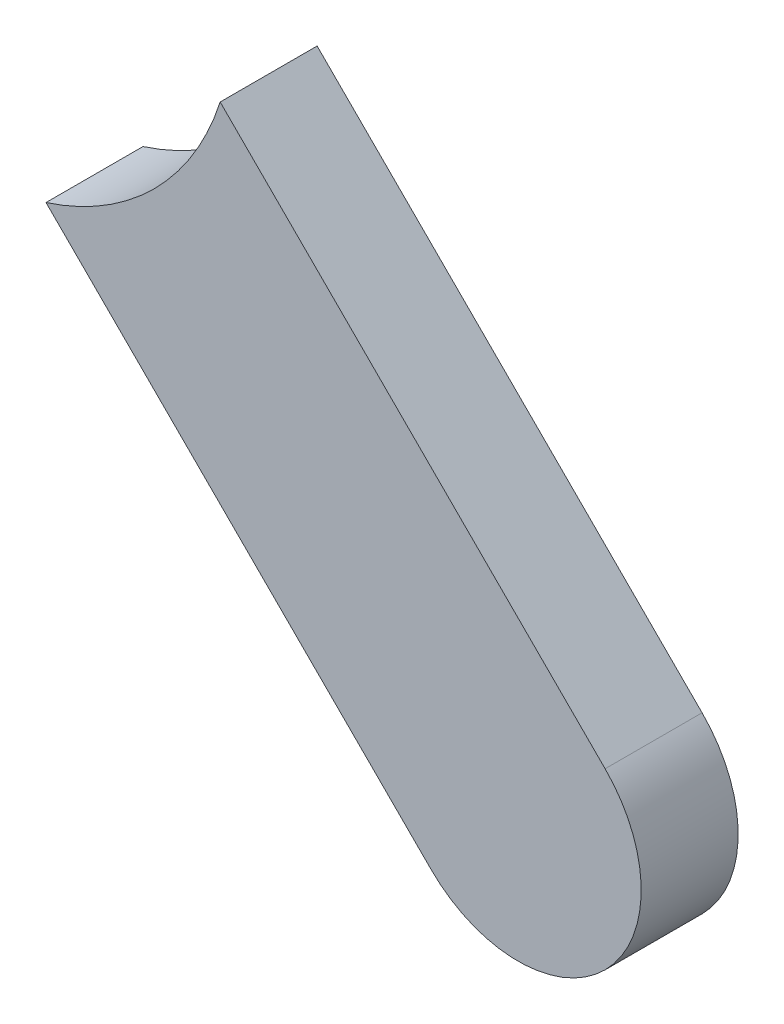
ISO-10303-21;
HEADER;
FILE_DESCRIPTION(('STEP AP214'),'2;1');
FILE_NAME('part.step','',(''),(''),'','','');
FILE_SCHEMA(('AUTOMOTIVE_DESIGN { 1 0 10303 214 1 1 1 1 }'));
ENDSEC;
DATA;
#1=APPLICATION_CONTEXT('core data for automotive mechanical design processes');
#2=APPLICATION_PROTOCOL_DEFINITION('international standard','automotive_design',2000,#1);
#3=PRODUCT_CONTEXT('',#1,'mechanical');
#4=PRODUCT('Part','Part','',(#3));
#5=PRODUCT_RELATED_PRODUCT_CATEGORY('part','',(#4));
#6=PRODUCT_DEFINITION_FORMATION('','',#4);
#7=PRODUCT_DEFINITION_CONTEXT('part definition',#1,'design');
#8=PRODUCT_DEFINITION('design','',#6,#7);
#9=PRODUCT_DEFINITION_SHAPE('','',#8);
#10=(LENGTH_UNIT() NAMED_UNIT(*) SI_UNIT(.MILLI.,.METRE.));
#11=(NAMED_UNIT(*) PLANE_ANGLE_UNIT() SI_UNIT($,.RADIAN.));
#12=(NAMED_UNIT(*) SI_UNIT($,.STERADIAN.) SOLID_ANGLE_UNIT());
#13=UNCERTAINTY_MEASURE_WITH_UNIT(LENGTH_MEASURE(1.E-05),#10,'distance_accuracy_value','');
#14=(GEOMETRIC_REPRESENTATION_CONTEXT(3) GLOBAL_UNCERTAINTY_ASSIGNED_CONTEXT((#13)) GLOBAL_UNIT_ASSIGNED_CONTEXT((#10,
#11,#12)) REPRESENTATION_CONTEXT('',''));
#15=CARTESIAN_POINT('',(0.,0.,0.));
#16=DIRECTION('',(0.,0.,1.));
#17=DIRECTION('',(1.,0.,0.));
#18=AXIS2_PLACEMENT_3D('',#15,#16,#17);
#19=CARTESIAN_POINT('',(149.140327141144,77.7004637788559,0.));
#20=DIRECTION('',(0.707106781186548,0.707106781186548,0.));
#21=DIRECTION('',(0.707106781186548,-0.707106781186548,0.));
#22=AXIS2_PLACEMENT_3D('',#19,#20,#21);
#23=PLANE('',#22);
#24=DIRECTION('',(0.707106781186548,-0.707106781186548,0.));
#25=VECTOR('',#24,1.);
#26=CARTESIAN_POINT('',(148.79139406,78.04939686,0.1999996));
#27=LINE('',#26,#25);
#28=CARTESIAN_POINT('',(149.140327141144,77.7004637788559,0.1999996));
#29=VERTEX_POINT('',#28);
#30=CARTESIAN_POINT('',(149.93439406,76.90639686,0.1999996));
#31=VERTEX_POINT('',#30);
#32=EDGE_CURVE('E11',#29,#31,#27,.T.);
#33=ORIENTED_EDGE('',*,*,#32,.F.);
#34=DIRECTION('',(0.,0.,1.));
#35=VECTOR('',#34,1.);
#36=CARTESIAN_POINT('',(149.140327141144,77.7004637788559,0.));
#37=LINE('',#36,#35);
#38=CARTESIAN_POINT('',(149.140327141144,77.7004637788559,0.));
#39=VERTEX_POINT('',#38);
#40=EDGE_CURVE('E24',#39,#29,#37,.T.);
#41=ORIENTED_EDGE('',*,*,#40,.F.);
#42=DIRECTION('',(0.707106781186548,-0.707106781186548,0.));
#43=VECTOR('',#42,1.);
#44=CARTESIAN_POINT('',(148.79139406,78.04939686,0.));
#45=LINE('',#44,#43);
#46=CARTESIAN_POINT('',(149.93439406,76.90639686,0.));
#47=VERTEX_POINT('',#46);
#48=EDGE_CURVE('E75',#39,#47,#45,.T.);
#49=ORIENTED_EDGE('',*,*,#48,.T.);
#50=DIRECTION('',(0.,0.,1.));
#51=VECTOR('',#50,1.);
#52=CARTESIAN_POINT('',(149.93439406,76.90639686,0.));
#53=LINE('',#52,#51);
#54=EDGE_CURVE('E37',#47,#31,#53,.T.);
#55=ORIENTED_EDGE('',*,*,#54,.T.);
#56=EDGE_LOOP('',(#33,#41,#49,#55));
#57=FACE_BOUND('',#56,.T.);
#58=ADVANCED_FACE('F17',(#57),#23,.F.);
#59=CARTESIAN_POINT('',(150.114,77.0860028,0.));
#60=DIRECTION('',(0.,0.,-1.));
#61=DIRECTION('',(-0.707106781186548,-0.707106781186548,0.));
#62=AXIS2_PLACEMENT_3D('',#59,#60,#61);
#63=CYLINDRICAL_SURFACE('',#62,0.254001156230768);
#64=CARTESIAN_POINT('',(150.114,77.0860028,0.1999996));
#65=DIRECTION('',(0.,0.,1.));
#66=DIRECTION('',(-0.707106781186548,-0.707106781186548,0.));
#67=AXIS2_PLACEMENT_3D('',#64,#65,#66);
#68=CIRCLE('',#67,0.254001156230768);
#69=CARTESIAN_POINT('',(150.29360594,77.26560874,0.1999996));
#70=VERTEX_POINT('',#69);
#71=EDGE_CURVE('E83',#31,#70,#68,.T.);
#72=ORIENTED_EDGE('',*,*,#71,.F.);
#73=ORIENTED_EDGE('',*,*,#54,.F.);
#74=CARTESIAN_POINT('',(150.114,77.0860028,0.));
#75=DIRECTION('',(0.,0.,1.));
#76=DIRECTION('',(-0.707106781186548,-0.707106781186548,0.));
#77=AXIS2_PLACEMENT_3D('',#74,#75,#76);
#78=CIRCLE('',#77,0.254001156230768);
#79=CARTESIAN_POINT('',(150.29360594,77.26560874,0.));
#80=VERTEX_POINT('',#79);
#81=EDGE_CURVE('E81',#47,#80,#78,.T.);
#82=ORIENTED_EDGE('',*,*,#81,.T.);
#83=DIRECTION('',(0.,0.,1.));
#84=VECTOR('',#83,1.);
#85=CARTESIAN_POINT('',(150.29360594,77.26560874,0.));
#86=LINE('',#85,#84);
#87=EDGE_CURVE('E67',#80,#70,#86,.T.);
#88=ORIENTED_EDGE('',*,*,#87,.T.);
#89=EDGE_LOOP('',(#72,#73,#82,#88));
#90=FACE_BOUND('',#89,.T.);
#91=ADVANCED_FACE('F89',(#90),#63,.T.);
#92=CARTESIAN_POINT('',(150.29360594,77.26560874,0.));
#93=DIRECTION('',(-0.707106781186548,-0.707106781186548,0.));
#94=DIRECTION('',(-0.707106781186548,0.707106781186548,0.));
#95=AXIS2_PLACEMENT_3D('',#92,#93,#94);
#96=PLANE('',#95);
#97=DIRECTION('',(-0.707106781186548,0.707106781186548,0.));
#98=VECTOR('',#97,1.);
#99=CARTESIAN_POINT('',(150.29360594,77.26560874,0.1999996));
#100=LINE('',#99,#98);
#101=CARTESIAN_POINT('',(149.499539021144,78.0596756588559,0.1999996));
#102=VERTEX_POINT('',#101);
#103=EDGE_CURVE('E71',#70,#102,#100,.T.);
#104=ORIENTED_EDGE('',*,*,#103,.F.);
#105=ORIENTED_EDGE('',*,*,#87,.F.);
#106=DIRECTION('',(-0.707106781186548,0.707106781186548,0.));
#107=VECTOR('',#106,1.);
#108=CARTESIAN_POINT('',(150.29360594,77.26560874,0.));
#109=LINE('',#108,#107);
#110=CARTESIAN_POINT('',(149.499539021144,78.0596756588559,0.));
#111=VERTEX_POINT('',#110);
#112=EDGE_CURVE('E63',#80,#111,#109,.T.);
#113=ORIENTED_EDGE('',*,*,#112,.T.);
#114=DIRECTION('',(0.,0.,1.));
#115=VECTOR('',#114,1.);
#116=CARTESIAN_POINT('',(149.499539021144,78.0596756588559,0.));
#117=LINE('',#116,#115);
#118=EDGE_CURVE('E53',#111,#102,#117,.T.);
#119=ORIENTED_EDGE('',*,*,#118,.T.);
#120=EDGE_LOOP('',(#104,#105,#113,#119));
#121=FACE_BOUND('',#120,.T.);
#122=ADVANCED_FACE('F66',(#121),#96,.F.);
#123=CARTESIAN_POINT('',(148.971,78.2290028,0.));
#124=DIRECTION('',(0.,0.,-1.));
#125=DIRECTION('',(1.,0.,0.));
#126=AXIS2_PLACEMENT_3D('',#123,#124,#125);
#127=CYLINDRICAL_SURFACE('',#126,0.55500016);
#128=ORIENTED_EDGE('',*,*,#40,.T.);
#129=CARTESIAN_POINT('',(148.971,78.2290028,0.1999996));
#130=DIRECTION('',(0.,0.,1.));
#131=DIRECTION('',(1.,0.,0.));
#132=AXIS2_PLACEMENT_3D('',#129,#130,#131);
#133=CIRCLE('',#132,0.55500016);
#134=EDGE_CURVE('E59',#29,#102,#133,.T.);
#135=ORIENTED_EDGE('',*,*,#134,.T.);
#136=ORIENTED_EDGE('',*,*,#118,.F.);
#137=CARTESIAN_POINT('',(148.971,78.2290028,0.));
#138=DIRECTION('',(0.,0.,1.));
#139=DIRECTION('',(1.,0.,0.));
#140=AXIS2_PLACEMENT_3D('',#137,#138,#139);
#141=CIRCLE('',#140,0.55500016);
#142=EDGE_CURVE('E57',#39,#111,#141,.T.);
#143=ORIENTED_EDGE('',*,*,#142,.F.);
#144=EDGE_LOOP('',(#128,#135,#136,#143));
#145=FACE_BOUND('',#144,.T.);
#146=ADVANCED_FACE('F55',(#145),#127,.F.);
#147=CARTESIAN_POINT('',(148.79139406,78.04939686,0.));
#148=DIRECTION('',(0.,0.,-1.));
#149=DIRECTION('',(-1.,0.,0.));
#150=AXIS2_PLACEMENT_3D('',#147,#148,#149);
#151=PLANE('',#150);
#152=ORIENTED_EDGE('',*,*,#48,.F.);
#153=ORIENTED_EDGE('',*,*,#142,.T.);
#154=ORIENTED_EDGE('',*,*,#112,.F.);
#155=ORIENTED_EDGE('',*,*,#81,.F.);
#156=EDGE_LOOP('',(#152,#153,#154,#155));
#157=FACE_BOUND('',#156,.T.);
#158=ADVANCED_FACE('F74',(#157),#151,.T.);
#159=CARTESIAN_POINT('',(148.79139406,78.04939686,0.1999996));
#160=DIRECTION('',(0.,0.,-1.));
#161=DIRECTION('',(-1.,0.,0.));
#162=AXIS2_PLACEMENT_3D('',#159,#160,#161);
#163=PLANE('',#162);
#164=ORIENTED_EDGE('',*,*,#134,.F.);
#165=ORIENTED_EDGE('',*,*,#32,.T.);
#166=ORIENTED_EDGE('',*,*,#71,.T.);
#167=ORIENTED_EDGE('',*,*,#103,.T.);
#168=EDGE_LOOP('',(#164,#165,#166,#167));
#169=FACE_BOUND('',#168,.T.);
#170=ADVANCED_FACE('F91',(#169),#163,.F.);
#171=CLOSED_SHELL('',(#58,#91,#122,#146,#158,#170));
#172=MANIFOLD_SOLID_BREP('B1',#171);
#173=ADVANCED_BREP_SHAPE_REPRESENTATION('',(#18,#172),#14);
#174=SHAPE_DEFINITION_REPRESENTATION(#9,#173);
ENDSEC;
END-ISO-10303-21;
